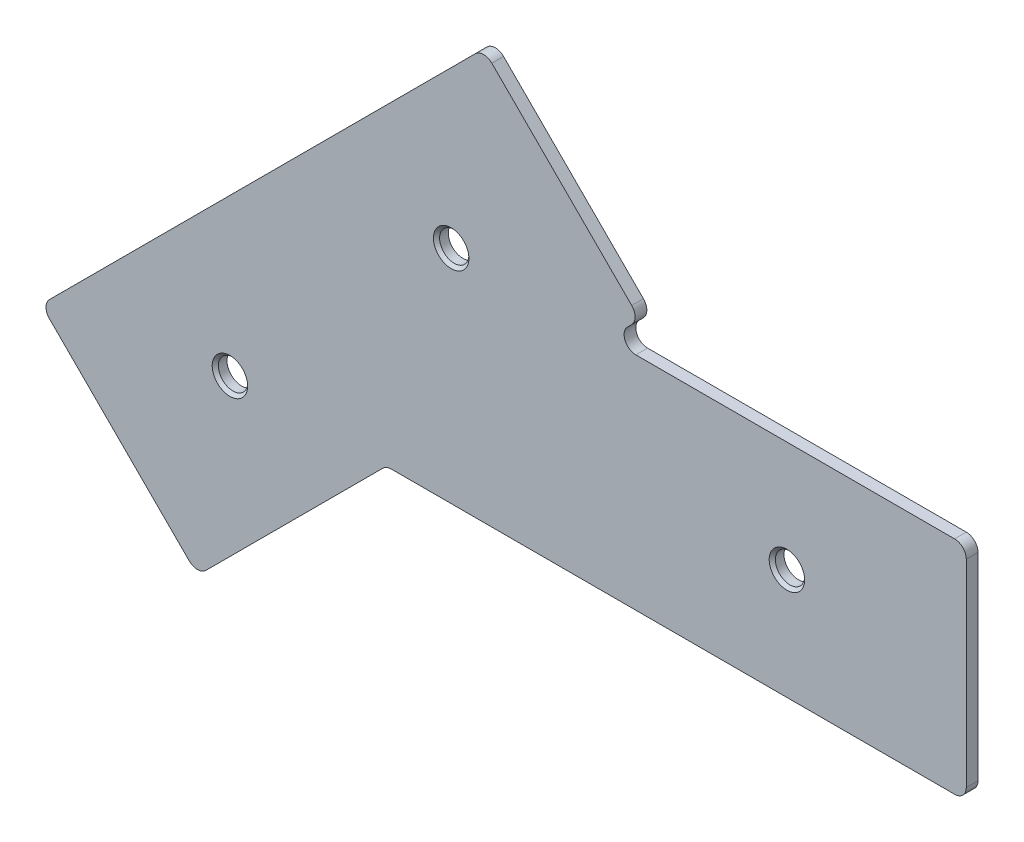
ISO-10303-21;
HEADER;
FILE_DESCRIPTION(('STEP AP214'),'2;1');
FILE_NAME('part.step','',(''),(''),'','','');
FILE_SCHEMA(('AUTOMOTIVE_DESIGN { 1 0 10303 214 1 1 1 1 }'));
ENDSEC;
DATA;
#1=APPLICATION_CONTEXT('core data for automotive mechanical design processes');
#2=APPLICATION_PROTOCOL_DEFINITION('international standard','automotive_design',2000,#1);
#3=PRODUCT_CONTEXT('',#1,'mechanical');
#4=PRODUCT('Part','Part','',(#3));
#5=PRODUCT_RELATED_PRODUCT_CATEGORY('part','',(#4));
#6=PRODUCT_DEFINITION_FORMATION('','',#4);
#7=PRODUCT_DEFINITION_CONTEXT('part definition',#1,'design');
#8=PRODUCT_DEFINITION('design','',#6,#7);
#9=PRODUCT_DEFINITION_SHAPE('','',#8);
#10=(LENGTH_UNIT() NAMED_UNIT(*) SI_UNIT(.MILLI.,.METRE.));
#11=(NAMED_UNIT(*) PLANE_ANGLE_UNIT() SI_UNIT($,.RADIAN.));
#12=(NAMED_UNIT(*) SI_UNIT($,.STERADIAN.) SOLID_ANGLE_UNIT());
#13=UNCERTAINTY_MEASURE_WITH_UNIT(LENGTH_MEASURE(1.E-05),#10,'distance_accuracy_value','');
#14=(GEOMETRIC_REPRESENTATION_CONTEXT(3) GLOBAL_UNCERTAINTY_ASSIGNED_CONTEXT((#13)) GLOBAL_UNIT_ASSIGNED_CONTEXT((#10,
#11,#12)) REPRESENTATION_CONTEXT('',''));
#15=CARTESIAN_POINT('',(0.,0.,0.));
#16=DIRECTION('',(0.,0.,1.));
#17=DIRECTION('',(1.,0.,0.));
#18=AXIS2_PLACEMENT_3D('',#15,#16,#17);
#19=CARTESIAN_POINT('',(-13.3466404948961,13.3466404948961,-2.));
#20=DIRECTION('',(-0.707106781186547,-0.707106781186547,0.));
#21=DIRECTION('',(0.707106781186548,-0.707106781186548,0.));
#22=AXIS2_PLACEMENT_3D('',#19,#20,#21);
#23=PLANE('',#22);
#24=DIRECTION('',(0.707106781186548,-0.707106781186548,0.));
#25=VECTOR('',#24,1.);
#26=CARTESIAN_POINT('',(-13.3466404948961,13.3466404948961,0.));
#27=LINE('',#26,#25);
#28=CARTESIAN_POINT('',(-11.932426932523,11.932426932523,0.));
#29=VERTEX_POINT('',#28);
#30=CARTESIAN_POINT('',(11.932426932523,-11.932426932523,0.));
#31=VERTEX_POINT('',#30);
#32=EDGE_CURVE('E284',#29,#31,#27,.T.);
#33=ORIENTED_EDGE('',*,*,#32,.F.);
#34=DIRECTION('',(0.,0.,1.));
#35=VECTOR('',#34,1.);
#36=CARTESIAN_POINT('',(-11.932426932523,11.932426932523,-2.));
#37=LINE('',#36,#35);
#38=CARTESIAN_POINT('',(-11.932426932523,11.932426932523,-2.));
#39=VERTEX_POINT('',#38);
#40=EDGE_CURVE('E226',#29,#39,#37,.F.);
#41=ORIENTED_EDGE('',*,*,#40,.T.);
#42=DIRECTION('',(0.707106781186548,-0.707106781186548,0.));
#43=VECTOR('',#42,1.);
#44=CARTESIAN_POINT('',(-13.3466404948961,13.3466404948961,-2.));
#45=LINE('',#44,#43);
#46=CARTESIAN_POINT('',(11.932426932523,-11.932426932523,-2.));
#47=VERTEX_POINT('',#46);
#48=EDGE_CURVE('E300',#39,#47,#45,.T.);
#49=ORIENTED_EDGE('',*,*,#48,.T.);
#50=DIRECTION('',(0.,0.,1.));
#51=VECTOR('',#50,1.);
#52=CARTESIAN_POINT('',(11.932426932523,-11.932426932523,-2.));
#53=LINE('',#52,#51);
#54=EDGE_CURVE('E223',#47,#31,#53,.T.);
#55=ORIENTED_EDGE('',*,*,#54,.T.);
#56=EDGE_LOOP('',(#33,#41,#49,#55));
#57=FACE_BOUND('',#56,.T.);
#58=ADVANCED_FACE('F49',(#57),#23,.T.);
#59=CARTESIAN_POINT('',(-13.3466404948961,13.3466404948961,-2.));
#60=DIRECTION('',(-0.707106781186547,0.707106781186547,0.));
#61=DIRECTION('',(-0.707106781186548,-0.707106781186548,0.));
#62=AXIS2_PLACEMENT_3D('',#59,#60,#61);
#63=PLANE('',#62);
#64=DIRECTION('',(-0.707106781186547,-0.707106781186547,0.));
#65=VECTOR('',#64,1.);
#66=CARTESIAN_POINT('',(-13.3466404948961,13.3466404948961,0.));
#67=LINE('',#66,#65);
#68=CARTESIAN_POINT('',(60.7581501734541,87.4514311632462,0.));
#69=VERTEX_POINT('',#68);
#70=CARTESIAN_POINT('',(-11.932426932523,14.7608540572692,0.));
#71=VERTEX_POINT('',#70);
#72=EDGE_CURVE('E183',#69,#71,#67,.T.);
#73=ORIENTED_EDGE('',*,*,#72,.F.);
#74=DIRECTION('',(0.,0.,1.));
#75=VECTOR('',#74,1.);
#76=CARTESIAN_POINT('',(60.7581501734541,87.4514311632462,-2.));
#77=LINE('',#76,#75);
#78=CARTESIAN_POINT('',(60.7581501734541,87.4514311632462,-2.));
#79=VERTEX_POINT('',#78);
#80=EDGE_CURVE('E210',#69,#79,#77,.F.);
#81=ORIENTED_EDGE('',*,*,#80,.T.);
#82=DIRECTION('',(-0.707106781186547,-0.707106781186547,0.));
#83=VECTOR('',#82,1.);
#84=CARTESIAN_POINT('',(-13.3466404948961,13.3466404948961,-2.));
#85=LINE('',#84,#83);
#86=CARTESIAN_POINT('',(-11.932426932523,14.7608540572692,-2.));
#87=VERTEX_POINT('',#86);
#88=EDGE_CURVE('E188',#79,#87,#85,.T.);
#89=ORIENTED_EDGE('',*,*,#88,.T.);
#90=DIRECTION('',(0.,0.,1.));
#91=VECTOR('',#90,1.);
#92=CARTESIAN_POINT('',(-11.932426932523,14.7608540572692,-2.));
#93=LINE('',#92,#91);
#94=EDGE_CURVE('E207',#87,#71,#93,.T.);
#95=ORIENTED_EDGE('',*,*,#94,.T.);
#96=EDGE_LOOP('',(#73,#81,#89,#95));
#97=FACE_BOUND('',#96,.T.);
#98=ADVANCED_FACE('F351',(#97),#63,.T.);
#99=CARTESIAN_POINT('',(62.1723637358272,88.8656447256193,-2.));
#100=DIRECTION('',(0.707106781186547,0.707106781186547,0.));
#101=DIRECTION('',(-0.707106781186548,0.707106781186548,0.));
#102=AXIS2_PLACEMENT_3D('',#99,#100,#101);
#103=PLANE('',#102);
#104=DIRECTION('',(-0.707106781186547,0.707106781186547,0.));
#105=VECTOR('',#104,1.);
#106=CARTESIAN_POINT('',(62.1723637358272,88.8656447256193,-2.));
#107=LINE('',#106,#105);
#108=CARTESIAN_POINT('',(87.4514311632462,63.5865772982002,-2.));
#109=VERTEX_POINT('',#108);
#110=CARTESIAN_POINT('',(63.5865772982003,87.4514311632462,-2.));
#111=VERTEX_POINT('',#110);
#112=EDGE_CURVE('E192',#109,#111,#107,.T.);
#113=ORIENTED_EDGE('',*,*,#112,.T.);
#114=DIRECTION('',(0.,0.,1.));
#115=VECTOR('',#114,1.);
#116=CARTESIAN_POINT('',(63.5865772982003,87.4514311632462,-2.));
#117=LINE('',#116,#115);
#118=CARTESIAN_POINT('',(63.5865772982003,87.4514311632462,0.));
#119=VERTEX_POINT('',#118);
#120=EDGE_CURVE('E174',#111,#119,#117,.T.);
#121=ORIENTED_EDGE('',*,*,#120,.T.);
#122=DIRECTION('',(-0.707106781186547,0.707106781186547,0.));
#123=VECTOR('',#122,1.);
#124=CARTESIAN_POINT('',(62.1723637358272,88.8656447256193,0.));
#125=LINE('',#124,#123);
#126=CARTESIAN_POINT('',(87.4514311632462,63.5865772982002,0.));
#127=VERTEX_POINT('',#126);
#128=EDGE_CURVE('E166',#127,#119,#125,.T.);
#129=ORIENTED_EDGE('',*,*,#128,.F.);
#130=DIRECTION('',(0.,0.,1.));
#131=VECTOR('',#130,1.);
#132=CARTESIAN_POINT('',(87.4514311632462,63.5865772982002,-2.));
#133=LINE('',#132,#131);
#134=EDGE_CURVE('E180',#127,#109,#133,.F.);
#135=ORIENTED_EDGE('',*,*,#134,.T.);
#136=EDGE_LOOP('',(#113,#121,#129,#135));
#137=FACE_BOUND('',#136,.T.);
#138=ADVANCED_FACE('F179',(#137),#103,.T.);
#139=CARTESIAN_POINT('',(83.3277831051539,56.6345021153617,-2.));
#140=DIRECTION('',(0.707106781186547,-0.707106781186548,0.));
#141=DIRECTION('',(0.707106781186548,0.707106781186547,0.));
#142=AXIS2_PLACEMENT_3D('',#139,#140,#141);
#143=PLANE('',#142);
#144=DIRECTION('',(0.707106781186548,0.707106781186547,0.));
#145=VECTOR('',#144,1.);
#146=CARTESIAN_POINT('',(83.3277831051539,56.6345021153617,-2.));
#147=LINE('',#146,#145);
#148=CARTESIAN_POINT('',(86.741996667527,60.0487156777348,-2.));
#149=VERTEX_POINT('',#148);
#150=CARTESIAN_POINT('',(87.4514311632462,60.7581501734541,-2.));
#151=VERTEX_POINT('',#150);
#152=EDGE_CURVE('E271',#149,#151,#147,.T.);
#153=ORIENTED_EDGE('',*,*,#152,.T.);
#154=DIRECTION('',(0.,0.,1.));
#155=VECTOR('',#154,1.);
#156=CARTESIAN_POINT('',(87.4514311632462,60.7581501734541,-2.));
#157=LINE('',#156,#155);
#158=CARTESIAN_POINT('',(87.4514311632462,60.7581501734541,0.));
#159=VERTEX_POINT('',#158);
#160=EDGE_CURVE('E249',#151,#159,#157,.T.);
#161=ORIENTED_EDGE('',*,*,#160,.T.);
#162=DIRECTION('',(0.707106781186548,0.707106781186547,0.));
#163=VECTOR('',#162,1.);
#164=CARTESIAN_POINT('',(83.3277831051539,56.6345021153617,0.));
#165=LINE('',#164,#163);
#166=CARTESIAN_POINT('',(86.741996667527,60.0487156777348,0.));
#167=VERTEX_POINT('',#166);
#168=EDGE_CURVE('E168',#167,#159,#165,.T.);
#169=ORIENTED_EDGE('',*,*,#168,.F.);
#170=DIRECTION('',(0.,0.,1.));
#171=VECTOR('',#170,1.);
#172=CARTESIAN_POINT('',(86.741996667527,60.0487156777348,-2.));
#173=LINE('',#172,#171);
#174=EDGE_CURVE('E247',#167,#149,#173,.F.);
#175=ORIENTED_EDGE('',*,*,#174,.T.);
#176=EDGE_LOOP('',(#153,#161,#169,#175));
#177=FACE_BOUND('',#176,.T.);
#178=ADVANCED_FACE('F261',(#177),#143,.T.);
#179=CARTESIAN_POINT('',(83.3277831051539,56.6345021153617,-2.));
#180=DIRECTION('',(0.,1.,0.));
#181=DIRECTION('',(0.,0.,1.));
#182=AXIS2_PLACEMENT_3D('',#179,#180,#181);
#183=PLANE('',#182);
#184=DIRECTION('',(-1.,0.,0.));
#185=VECTOR('',#184,1.);
#186=CARTESIAN_POINT('',(83.3277831051539,56.6345021153617,0.));
#187=LINE('',#186,#185);
#188=CARTESIAN_POINT('',(142.559502115362,56.6345021153617,0.));
#189=VERTEX_POINT('',#188);
#190=CARTESIAN_POINT('',(88.1562102299001,56.6345021153617,0.));
#191=VERTEX_POINT('',#190);
#192=EDGE_CURVE('E255',#189,#191,#187,.T.);
#193=ORIENTED_EDGE('',*,*,#192,.F.);
#194=DIRECTION('',(0.,0.,1.));
#195=VECTOR('',#194,1.);
#196=CARTESIAN_POINT('',(142.559502115362,56.6345021153617,-2.));
#197=LINE('',#196,#195);
#198=CARTESIAN_POINT('',(142.559502115362,56.6345021153617,-2.));
#199=VERTEX_POINT('',#198);
#200=EDGE_CURVE('E245',#189,#199,#197,.F.);
#201=ORIENTED_EDGE('',*,*,#200,.T.);
#202=DIRECTION('',(-1.,0.,0.));
#203=VECTOR('',#202,1.);
#204=CARTESIAN_POINT('',(83.3277831051539,56.6345021153617,-2.));
#205=LINE('',#204,#203);
#206=CARTESIAN_POINT('',(88.1562102299001,56.6345021153617,-2.));
#207=VERTEX_POINT('',#206);
#208=EDGE_CURVE('E269',#199,#207,#205,.T.);
#209=ORIENTED_EDGE('',*,*,#208,.T.);
#210=DIRECTION('',(0.,0.,1.));
#211=VECTOR('',#210,1.);
#212=CARTESIAN_POINT('',(88.1562102299001,56.6345021153617,0.));
#213=LINE('',#212,#211);
#214=EDGE_CURVE('E242',#207,#191,#213,.T.);
#215=ORIENTED_EDGE('',*,*,#214,.T.);
#216=EDGE_LOOP('',(#193,#201,#209,#215));
#217=FACE_BOUND('',#216,.T.);
#218=ADVANCED_FACE('F273',(#217),#183,.T.);
#219=CARTESIAN_POINT('',(144.559502115362,56.6345021153617,-2.));
#220=DIRECTION('',(1.,0.,0.));
#221=DIRECTION('',(0.,0.,-1.));
#222=AXIS2_PLACEMENT_3D('',#219,#220,#221);
#223=PLANE('',#222);
#224=DIRECTION('',(0.,1.,0.));
#225=VECTOR('',#224,1.);
#226=CARTESIAN_POINT('',(144.559502115362,56.6345021153617,0.));
#227=LINE('',#226,#225);
#228=CARTESIAN_POINT('',(144.559502115362,20.8845021153617,0.));
#229=VERTEX_POINT('',#228);
#230=CARTESIAN_POINT('',(144.559502115362,54.6345021153617,0.));
#231=VERTEX_POINT('',#230);
#232=EDGE_CURVE('E294',#229,#231,#227,.T.);
#233=ORIENTED_EDGE('',*,*,#232,.F.);
#234=DIRECTION('',(0.,0.,1.));
#235=VECTOR('',#234,1.);
#236=CARTESIAN_POINT('',(144.559502115362,20.8845021153617,-2.));
#237=LINE('',#236,#235);
#238=CARTESIAN_POINT('',(144.559502115362,20.8845021153617,-2.));
#239=VERTEX_POINT('',#238);
#240=EDGE_CURVE('E240',#229,#239,#237,.F.);
#241=ORIENTED_EDGE('',*,*,#240,.T.);
#242=DIRECTION('',(0.,1.,0.));
#243=VECTOR('',#242,1.);
#244=CARTESIAN_POINT('',(144.559502115362,56.6345021153617,-2.));
#245=LINE('',#244,#243);
#246=CARTESIAN_POINT('',(144.559502115362,54.6345021153617,-2.));
#247=VERTEX_POINT('',#246);
#248=EDGE_CURVE('E275',#239,#247,#245,.T.);
#249=ORIENTED_EDGE('',*,*,#248,.T.);
#250=DIRECTION('',(0.,0.,1.));
#251=VECTOR('',#250,1.);
#252=CARTESIAN_POINT('',(144.559502115362,54.6345021153617,-2.));
#253=LINE('',#252,#251);
#254=EDGE_CURVE('E237',#247,#231,#253,.T.);
#255=ORIENTED_EDGE('',*,*,#254,.T.);
#256=EDGE_LOOP('',(#233,#241,#249,#255));
#257=FACE_BOUND('',#256,.T.);
#258=ADVANCED_FACE('F337',(#257),#223,.T.);
#259=CARTESIAN_POINT('',(45.5777831051539,18.8845021153617,-2.));
#260=DIRECTION('',(0.,-1.,0.));
#261=DIRECTION('',(1.,0.,0.));
#262=AXIS2_PLACEMENT_3D('',#259,#260,#261);
#263=PLANE('',#262);
#264=DIRECTION('',(1.,0.,0.));
#265=VECTOR('',#264,1.);
#266=CARTESIAN_POINT('',(45.5777831051539,18.8845021153617,0.));
#267=LINE('',#266,#265);
#268=CARTESIAN_POINT('',(46.4062102299001,18.8845021153617,0.));
#269=VERTEX_POINT('',#268);
#270=CARTESIAN_POINT('',(142.559502115362,18.8845021153617,0.));
#271=VERTEX_POINT('',#270);
#272=EDGE_CURVE('E291',#269,#271,#267,.T.);
#273=ORIENTED_EDGE('',*,*,#272,.F.);
#274=DIRECTION('',(0.,0.,1.));
#275=VECTOR('',#274,1.);
#276=CARTESIAN_POINT('',(46.4062102299001,18.8845021153617,-2.));
#277=LINE('',#276,#275);
#278=CARTESIAN_POINT('',(46.4062102299001,18.8845021153617,-2.));
#279=VERTEX_POINT('',#278);
#280=EDGE_CURVE('E235',#269,#279,#277,.F.);
#281=ORIENTED_EDGE('',*,*,#280,.T.);
#282=DIRECTION('',(1.,0.,0.));
#283=VECTOR('',#282,1.);
#284=CARTESIAN_POINT('',(45.5777831051539,18.8845021153617,-2.));
#285=LINE('',#284,#283);
#286=CARTESIAN_POINT('',(142.559502115362,18.8845021153617,-2.));
#287=VERTEX_POINT('',#286);
#288=EDGE_CURVE('E279',#279,#287,#285,.T.);
#289=ORIENTED_EDGE('',*,*,#288,.T.);
#290=DIRECTION('',(0.,0.,1.));
#291=VECTOR('',#290,1.);
#292=CARTESIAN_POINT('',(142.559502115362,18.8845021153617,-2.));
#293=LINE('',#292,#291);
#294=EDGE_CURVE('E232',#287,#271,#293,.T.);
#295=ORIENTED_EDGE('',*,*,#294,.T.);
#296=EDGE_LOOP('',(#273,#281,#289,#295));
#297=FACE_BOUND('',#296,.T.);
#298=ADVANCED_FACE('F329',(#297),#263,.T.);
#299=CARTESIAN_POINT('',(13.3466404948961,-13.3466404948961,-2.));
#300=DIRECTION('',(0.707106781186547,-0.707106781186547,0.));
#301=DIRECTION('',(0.707106781186548,0.707106781186548,0.));
#302=AXIS2_PLACEMENT_3D('',#299,#300,#301);
#303=PLANE('',#302);
#304=DIRECTION('',(0.707106781186548,0.707106781186548,0.));
#305=VECTOR('',#304,1.);
#306=CARTESIAN_POINT('',(13.3466404948961,-13.3466404948961,0.));
#307=LINE('',#306,#305);
#308=CARTESIAN_POINT('',(14.7608540572692,-11.932426932523,0.));
#309=VERTEX_POINT('',#308);
#310=CARTESIAN_POINT('',(44.991996667527,18.2987156777348,0.));
#311=VERTEX_POINT('',#310);
#312=EDGE_CURVE('E287',#309,#311,#307,.T.);
#313=ORIENTED_EDGE('',*,*,#312,.F.);
#314=DIRECTION('',(0.,0.,1.));
#315=VECTOR('',#314,1.);
#316=CARTESIAN_POINT('',(14.7608540572692,-11.932426932523,-2.));
#317=LINE('',#316,#315);
#318=CARTESIAN_POINT('',(14.7608540572692,-11.932426932523,-2.));
#319=VERTEX_POINT('',#318);
#320=EDGE_CURVE('E71',#309,#319,#317,.F.);
#321=ORIENTED_EDGE('',*,*,#320,.T.);
#322=DIRECTION('',(0.707106781186548,0.707106781186548,0.));
#323=VECTOR('',#322,1.);
#324=CARTESIAN_POINT('',(13.3466404948961,-13.3466404948961,-2.));
#325=LINE('',#324,#323);
#326=CARTESIAN_POINT('',(44.991996667527,18.2987156777348,-2.));
#327=VERTEX_POINT('',#326);
#328=EDGE_CURVE('E324',#319,#327,#325,.T.);
#329=ORIENTED_EDGE('',*,*,#328,.T.);
#330=DIRECTION('',(0.,0.,1.));
#331=VECTOR('',#330,1.);
#332=CARTESIAN_POINT('',(44.991996667527,18.2987156777348,0.));
#333=LINE('',#332,#331);
#334=EDGE_CURVE('E228',#327,#311,#333,.T.);
#335=ORIENTED_EDGE('',*,*,#334,.T.);
#336=EDGE_LOOP('',(#313,#321,#329,#335));
#337=FACE_BOUND('',#336,.T.);
#338=ADVANCED_FACE('F363',(#337),#303,.T.);
#339=CARTESIAN_POINT('',(0.,0.,-2.));
#340=DIRECTION('',(0.,0.,1.));
#341=DIRECTION('',(1.,0.,0.));
#342=AXIS2_PLACEMENT_3D('',#339,#340,#341);
#343=PLANE('',#342);
#344=CARTESIAN_POINT('',(56.6392531730424,56.6392531730424,-2.));
#345=DIRECTION('',(0.,0.,1.));
#346=DIRECTION('',(1.,0.,0.));
#347=AXIS2_PLACEMENT_3D('',#344,#345,#346);
#348=CIRCLE('',#347,2.49999999999999);
#349=CARTESIAN_POINT('',(59.1392531730424,56.6392531730424,-2.));
#350=VERTEX_POINT('',#349);
#351=EDGE_CURVE('E195',#350,#350,#348,.T.);
#352=ORIENTED_EDGE('',*,*,#351,.T.);
#353=EDGE_LOOP('',(#352));
#354=FACE_BOUND('',#353,.T.);
#355=CARTESIAN_POINT('',(18.8797510576808,18.8797510576808,-2.));
#356=DIRECTION('',(0.,0.,1.));
#357=DIRECTION('',(1.,0.,0.));
#358=AXIS2_PLACEMENT_3D('',#355,#356,#357);
#359=CIRCLE('',#358,2.49999999999999);
#360=CARTESIAN_POINT('',(21.3797510576808,18.8797510576808,-2.));
#361=VERTEX_POINT('',#360);
#362=EDGE_CURVE('E303',#361,#361,#359,.T.);
#363=ORIENTED_EDGE('',*,*,#362,.T.);
#364=EDGE_LOOP('',(#363));
#365=FACE_BOUND('',#364,.T.);
#366=CARTESIAN_POINT('',(113.943642610258,37.7595021153617,-2.));
#367=DIRECTION('',(0.,0.,1.));
#368=DIRECTION('',(1.,0.,0.));
#369=AXIS2_PLACEMENT_3D('',#366,#367,#368);
#370=CIRCLE('',#369,2.49999999999999);
#371=CARTESIAN_POINT('',(116.443642610258,37.7595021153617,-2.));
#372=VERTEX_POINT('',#371);
#373=EDGE_CURVE('E288',#372,#372,#370,.T.);
#374=ORIENTED_EDGE('',*,*,#373,.T.);
#375=EDGE_LOOP('',(#374));
#376=FACE_BOUND('',#375,.T.);
#377=ORIENTED_EDGE('',*,*,#88,.F.);
#378=CARTESIAN_POINT('',(62.1723637358272,86.0372176008731,-2.));
#379=DIRECTION('',(0.,0.,1.));
#380=DIRECTION('',(1.,0.,0.));
#381=AXIS2_PLACEMENT_3D('',#378,#379,#380);
#382=CIRCLE('',#381,2.);
#383=EDGE_CURVE('E221',#79,#111,#382,.F.);
#384=ORIENTED_EDGE('',*,*,#383,.T.);
#385=ORIENTED_EDGE('',*,*,#112,.F.);
#386=CARTESIAN_POINT('',(86.0372176008732,62.1723637358272,-2.));
#387=DIRECTION('',(0.,0.,1.));
#388=DIRECTION('',(1.,0.,0.));
#389=AXIS2_PLACEMENT_3D('',#386,#387,#388);
#390=CIRCLE('',#389,2.);
#391=EDGE_CURVE('E187',#109,#151,#390,.F.);
#392=ORIENTED_EDGE('',*,*,#391,.T.);
#393=ORIENTED_EDGE('',*,*,#152,.F.);
#394=CARTESIAN_POINT('',(88.1562102299001,58.6345021153617,-2.));
#395=DIRECTION('',(0.,0.,1.));
#396=DIRECTION('',(1.,0.,0.));
#397=AXIS2_PLACEMENT_3D('',#394,#395,#396);
#398=CIRCLE('',#397,2.);
#399=EDGE_CURVE('E11',#149,#207,#398,.T.);
#400=ORIENTED_EDGE('',*,*,#399,.T.);
#401=ORIENTED_EDGE('',*,*,#208,.F.);
#402=CARTESIAN_POINT('',(142.559502115362,54.6345021153617,-2.));
#403=DIRECTION('',(0.,0.,1.));
#404=DIRECTION('',(1.,0.,0.));
#405=AXIS2_PLACEMENT_3D('',#402,#403,#404);
#406=CIRCLE('',#405,2.);
#407=EDGE_CURVE('E213',#199,#247,#406,.F.);
#408=ORIENTED_EDGE('',*,*,#407,.T.);
#409=ORIENTED_EDGE('',*,*,#248,.F.);
#410=CARTESIAN_POINT('',(142.559502115362,20.8845021153617,-2.));
#411=DIRECTION('',(0.,0.,1.));
#412=DIRECTION('',(1.,0.,0.));
#413=AXIS2_PLACEMENT_3D('',#410,#411,#412);
#414=CIRCLE('',#413,2.);
#415=EDGE_CURVE('E215',#239,#287,#414,.F.);
#416=ORIENTED_EDGE('',*,*,#415,.T.);
#417=ORIENTED_EDGE('',*,*,#288,.F.);
#418=CARTESIAN_POINT('',(46.4062102299001,16.8845021153617,-2.));
#419=DIRECTION('',(0.,0.,1.));
#420=DIRECTION('',(1.,0.,0.));
#421=AXIS2_PLACEMENT_3D('',#418,#419,#420);
#422=CIRCLE('',#421,2.);
#423=EDGE_CURVE('E64',#279,#327,#422,.T.);
#424=ORIENTED_EDGE('',*,*,#423,.T.);
#425=ORIENTED_EDGE('',*,*,#328,.F.);
#426=CARTESIAN_POINT('',(13.3466404948961,-10.5182133701499,-2.));
#427=DIRECTION('',(0.,0.,1.));
#428=DIRECTION('',(1.,0.,0.));
#429=AXIS2_PLACEMENT_3D('',#426,#427,#428);
#430=CIRCLE('',#429,2.);
#431=EDGE_CURVE('E217',#319,#47,#430,.F.);
#432=ORIENTED_EDGE('',*,*,#431,.T.);
#433=ORIENTED_EDGE('',*,*,#48,.F.);
#434=CARTESIAN_POINT('',(-10.5182133701499,13.3466404948961,-2.));
#435=DIRECTION('',(0.,0.,1.));
#436=DIRECTION('',(1.,0.,0.));
#437=AXIS2_PLACEMENT_3D('',#434,#435,#436);
#438=CIRCLE('',#437,2.);
#439=EDGE_CURVE('E219',#39,#87,#438,.F.);
#440=ORIENTED_EDGE('',*,*,#439,.T.);
#441=EDGE_LOOP('',(#377,#384,#385,#392,#393,#400,#401,#408,#409,#416,#417,#424,#425,#432,#433,#440));
#442=FACE_BOUND('',#441,.T.);
#443=ADVANCED_FACE('F268',(#354,#365,#376,#442),#343,.F.);
#444=CARTESIAN_POINT('',(0.,0.,0.));
#445=DIRECTION('',(0.,0.,1.));
#446=DIRECTION('',(1.,0.,0.));
#447=AXIS2_PLACEMENT_3D('',#444,#445,#446);
#448=PLANE('',#447);
#449=CARTESIAN_POINT('',(56.6392531730424,56.6392531730424,0.));
#450=DIRECTION('',(0.,0.,1.));
#451=DIRECTION('',(1.,0.,0.));
#452=AXIS2_PLACEMENT_3D('',#449,#450,#451);
#453=CIRCLE('',#452,3.025);
#454=CARTESIAN_POINT('',(59.6642531730424,56.6392531730424,0.));
#455=VERTEX_POINT('',#454);
#456=EDGE_CURVE('E443',#455,#455,#453,.T.);
#457=ORIENTED_EDGE('',*,*,#456,.F.);
#458=EDGE_LOOP('',(#457));
#459=FACE_BOUND('',#458,.T.);
#460=CARTESIAN_POINT('',(18.8797510576808,18.8797510576808,0.));
#461=DIRECTION('',(0.,0.,1.));
#462=DIRECTION('',(1.,0.,0.));
#463=AXIS2_PLACEMENT_3D('',#460,#461,#462);
#464=CIRCLE('',#463,3.025);
#465=CARTESIAN_POINT('',(21.9047510576808,18.8797510576808,0.));
#466=VERTEX_POINT('',#465);
#467=EDGE_CURVE('E312',#466,#466,#464,.T.);
#468=ORIENTED_EDGE('',*,*,#467,.F.);
#469=EDGE_LOOP('',(#468));
#470=FACE_BOUND('',#469,.T.);
#471=CARTESIAN_POINT('',(113.943642610258,37.7595021153617,0.));
#472=DIRECTION('',(0.,0.,1.));
#473=DIRECTION('',(1.,0.,0.));
#474=AXIS2_PLACEMENT_3D('',#471,#472,#473);
#475=CIRCLE('',#474,3.025);
#476=CARTESIAN_POINT('',(116.968642610258,37.7595021153617,0.));
#477=VERTEX_POINT('',#476);
#478=EDGE_CURVE('E305',#477,#477,#475,.T.);
#479=ORIENTED_EDGE('',*,*,#478,.F.);
#480=EDGE_LOOP('',(#479));
#481=FACE_BOUND('',#480,.T.);
#482=ORIENTED_EDGE('',*,*,#128,.T.);
#483=CARTESIAN_POINT('',(62.1723637358272,86.0372176008731,0.));
#484=DIRECTION('',(0.,0.,1.));
#485=DIRECTION('',(1.,0.,0.));
#486=AXIS2_PLACEMENT_3D('',#483,#484,#485);
#487=CIRCLE('',#486,2.);
#488=EDGE_CURVE('E205',#119,#69,#487,.T.);
#489=ORIENTED_EDGE('',*,*,#488,.T.);
#490=ORIENTED_EDGE('',*,*,#72,.T.);
#491=CARTESIAN_POINT('',(-10.5182133701499,13.3466404948961,0.));
#492=DIRECTION('',(0.,0.,1.));
#493=DIRECTION('',(1.,0.,0.));
#494=AXIS2_PLACEMENT_3D('',#491,#492,#493);
#495=CIRCLE('',#494,2.);
#496=EDGE_CURVE('E203',#71,#29,#495,.T.);
#497=ORIENTED_EDGE('',*,*,#496,.T.);
#498=ORIENTED_EDGE('',*,*,#32,.T.);
#499=CARTESIAN_POINT('',(13.3466404948961,-10.5182133701499,0.));
#500=DIRECTION('',(0.,0.,1.));
#501=DIRECTION('',(1.,0.,0.));
#502=AXIS2_PLACEMENT_3D('',#499,#500,#501);
#503=CIRCLE('',#502,2.);
#504=EDGE_CURVE('E201',#31,#309,#503,.T.);
#505=ORIENTED_EDGE('',*,*,#504,.T.);
#506=ORIENTED_EDGE('',*,*,#312,.T.);
#507=CARTESIAN_POINT('',(46.4062102299001,16.8845021153617,0.));
#508=DIRECTION('',(0.,0.,1.));
#509=DIRECTION('',(1.,0.,0.));
#510=AXIS2_PLACEMENT_3D('',#507,#508,#509);
#511=CIRCLE('',#510,2.);
#512=EDGE_CURVE('E251',#311,#269,#511,.F.);
#513=ORIENTED_EDGE('',*,*,#512,.T.);
#514=ORIENTED_EDGE('',*,*,#272,.T.);
#515=CARTESIAN_POINT('',(142.559502115362,20.8845021153617,0.));
#516=DIRECTION('',(0.,0.,1.));
#517=DIRECTION('',(1.,0.,0.));
#518=AXIS2_PLACEMENT_3D('',#515,#516,#517);
#519=CIRCLE('',#518,2.);
#520=EDGE_CURVE('E199',#271,#229,#519,.T.);
#521=ORIENTED_EDGE('',*,*,#520,.T.);
#522=ORIENTED_EDGE('',*,*,#232,.T.);
#523=CARTESIAN_POINT('',(142.559502115362,54.6345021153617,0.));
#524=DIRECTION('',(0.,0.,1.));
#525=DIRECTION('',(1.,0.,0.));
#526=AXIS2_PLACEMENT_3D('',#523,#524,#525);
#527=CIRCLE('',#526,2.);
#528=EDGE_CURVE('E173',#231,#189,#527,.T.);
#529=ORIENTED_EDGE('',*,*,#528,.T.);
#530=ORIENTED_EDGE('',*,*,#192,.T.);
#531=CARTESIAN_POINT('',(88.1562102299001,58.6345021153617,0.));
#532=DIRECTION('',(0.,0.,1.));
#533=DIRECTION('',(1.,0.,0.));
#534=AXIS2_PLACEMENT_3D('',#531,#532,#533);
#535=CIRCLE('',#534,2.);
#536=EDGE_CURVE('E57',#191,#167,#535,.F.);
#537=ORIENTED_EDGE('',*,*,#536,.T.);
#538=ORIENTED_EDGE('',*,*,#168,.T.);
#539=CARTESIAN_POINT('',(86.0372176008732,62.1723637358272,0.));
#540=DIRECTION('',(0.,0.,1.));
#541=DIRECTION('',(1.,0.,0.));
#542=AXIS2_PLACEMENT_3D('',#539,#540,#541);
#543=CIRCLE('',#542,2.);
#544=EDGE_CURVE('E163',#159,#127,#543,.T.);
#545=ORIENTED_EDGE('',*,*,#544,.T.);
#546=EDGE_LOOP('',(#482,#489,#490,#497,#498,#505,#506,#513,#514,#521,#522,#529,#530,#537,#538,#545));
#547=FACE_BOUND('',#546,.T.);
#548=ADVANCED_FACE('F165',(#459,#470,#481,#547),#448,.T.);
#549=CARTESIAN_POINT('',(113.943642610258,37.7595021153617,0.));
#550=DIRECTION('',(0.,0.,1.));
#551=DIRECTION('',(1.,0.,0.));
#552=AXIS2_PLACEMENT_3D('',#549,#550,#551);
#553=CYLINDRICAL_SURFACE('',#552,2.49999999999999);
#554=CARTESIAN_POINT('',(113.943642610258,37.7595021153617,-0.525000000000012));
#555=DIRECTION('',(0.,0.,1.));
#556=DIRECTION('',(1.,0.,0.));
#557=AXIS2_PLACEMENT_3D('',#554,#555,#556);
#558=CIRCLE('',#557,2.49999999999999);
#559=CARTESIAN_POINT('',(116.443642610258,37.7595021153617,-0.525000000000012));
#560=VERTEX_POINT('',#559);
#561=EDGE_CURVE('E302',#560,#560,#558,.T.);
#562=ORIENTED_EDGE('',*,*,#561,.T.);
#563=EDGE_LOOP('',(#562));
#564=FACE_BOUND('',#563,.T.);
#565=ORIENTED_EDGE('',*,*,#373,.F.);
#566=EDGE_LOOP('',(#565));
#567=FACE_BOUND('',#566,.T.);
#568=ADVANCED_FACE('F411',(#564,#567),#553,.F.);
#569=CARTESIAN_POINT('',(113.943642610258,37.7595021153617,0.));
#570=DIRECTION('',(0.,0.,1.));
#571=DIRECTION('',(1.,0.,0.));
#572=AXIS2_PLACEMENT_3D('',#569,#570,#571);
#573=CONICAL_SURFACE('',#572,3.025,0.785398163397447);
#574=ORIENTED_EDGE('',*,*,#561,.F.);
#575=EDGE_LOOP('',(#574));
#576=FACE_BOUND('',#575,.T.);
#577=ORIENTED_EDGE('',*,*,#478,.T.);
#578=EDGE_LOOP('',(#577));
#579=FACE_BOUND('',#578,.T.);
#580=ADVANCED_FACE('F416',(#576,#579),#573,.F.);
#581=CARTESIAN_POINT('',(18.8797510576808,18.8797510576808,0.));
#582=DIRECTION('',(0.,0.,1.));
#583=DIRECTION('',(1.,0.,0.));
#584=AXIS2_PLACEMENT_3D('',#581,#582,#583);
#585=CYLINDRICAL_SURFACE('',#584,2.49999999999999);
#586=CARTESIAN_POINT('',(18.8797510576808,18.8797510576808,-0.525000000000012));
#587=DIRECTION('',(0.,0.,1.));
#588=DIRECTION('',(1.,0.,0.));
#589=AXIS2_PLACEMENT_3D('',#586,#587,#588);
#590=CIRCLE('',#589,2.49999999999999);
#591=CARTESIAN_POINT('',(21.3797510576808,18.8797510576808,-0.525000000000012));
#592=VERTEX_POINT('',#591);
#593=EDGE_CURVE('E306',#592,#592,#590,.T.);
#594=ORIENTED_EDGE('',*,*,#593,.T.);
#595=EDGE_LOOP('',(#594));
#596=FACE_BOUND('',#595,.T.);
#597=ORIENTED_EDGE('',*,*,#362,.F.);
#598=EDGE_LOOP('',(#597));
#599=FACE_BOUND('',#598,.T.);
#600=ADVANCED_FACE('F420',(#596,#599),#585,.F.);
#601=CARTESIAN_POINT('',(18.8797510576808,18.8797510576808,0.));
#602=DIRECTION('',(0.,0.,1.));
#603=DIRECTION('',(1.,0.,0.));
#604=AXIS2_PLACEMENT_3D('',#601,#602,#603);
#605=CONICAL_SURFACE('',#604,3.025,0.785398163397447);
#606=ORIENTED_EDGE('',*,*,#593,.F.);
#607=EDGE_LOOP('',(#606));
#608=FACE_BOUND('',#607,.T.);
#609=ORIENTED_EDGE('',*,*,#467,.T.);
#610=EDGE_LOOP('',(#609));
#611=FACE_BOUND('',#610,.T.);
#612=ADVANCED_FACE('F424',(#608,#611),#605,.F.);
#613=CARTESIAN_POINT('',(56.6392531730424,56.6392531730424,0.));
#614=DIRECTION('',(0.,0.,1.));
#615=DIRECTION('',(1.,0.,0.));
#616=AXIS2_PLACEMENT_3D('',#613,#614,#615);
#617=CYLINDRICAL_SURFACE('',#616,2.49999999999999);
#618=CARTESIAN_POINT('',(56.6392531730424,56.6392531730424,-0.525000000000012));
#619=DIRECTION('',(0.,0.,1.));
#620=DIRECTION('',(1.,0.,0.));
#621=AXIS2_PLACEMENT_3D('',#618,#619,#620);
#622=CIRCLE('',#621,2.49999999999999);
#623=CARTESIAN_POINT('',(59.1392531730424,56.6392531730424,-0.525000000000012));
#624=VERTEX_POINT('',#623);
#625=EDGE_CURVE('E440',#624,#624,#622,.T.);
#626=ORIENTED_EDGE('',*,*,#625,.T.);
#627=EDGE_LOOP('',(#626));
#628=FACE_BOUND('',#627,.T.);
#629=ORIENTED_EDGE('',*,*,#351,.F.);
#630=EDGE_LOOP('',(#629));
#631=FACE_BOUND('',#630,.T.);
#632=ADVANCED_FACE('F427',(#628,#631),#617,.F.);
#633=CARTESIAN_POINT('',(56.6392531730424,56.6392531730424,0.));
#634=DIRECTION('',(0.,0.,1.));
#635=DIRECTION('',(1.,0.,0.));
#636=AXIS2_PLACEMENT_3D('',#633,#634,#635);
#637=CONICAL_SURFACE('',#636,3.025,0.785398163397447);
#638=ORIENTED_EDGE('',*,*,#625,.F.);
#639=EDGE_LOOP('',(#638));
#640=FACE_BOUND('',#639,.T.);
#641=ORIENTED_EDGE('',*,*,#456,.T.);
#642=EDGE_LOOP('',(#641));
#643=FACE_BOUND('',#642,.T.);
#644=ADVANCED_FACE('F369',(#640,#643),#637,.F.);
#645=CARTESIAN_POINT('',(62.1723637358272,86.0372176008731,-2.));
#646=DIRECTION('',(0.,0.,1.));
#647=DIRECTION('',(1.,0.,0.));
#648=AXIS2_PLACEMENT_3D('',#645,#646,#647);
#649=CYLINDRICAL_SURFACE('',#648,2.);
#650=ORIENTED_EDGE('',*,*,#383,.F.);
#651=ORIENTED_EDGE('',*,*,#80,.F.);
#652=ORIENTED_EDGE('',*,*,#488,.F.);
#653=ORIENTED_EDGE('',*,*,#120,.F.);
#654=EDGE_LOOP('',(#650,#651,#652,#653));
#655=FACE_BOUND('',#654,.T.);
#656=ADVANCED_FACE('F365',(#655),#649,.T.);
#657=CARTESIAN_POINT('',(-10.5182133701499,13.3466404948961,-2.));
#658=DIRECTION('',(0.,0.,1.));
#659=DIRECTION('',(1.,0.,0.));
#660=AXIS2_PLACEMENT_3D('',#657,#658,#659);
#661=CYLINDRICAL_SURFACE('',#660,2.);
#662=ORIENTED_EDGE('',*,*,#439,.F.);
#663=ORIENTED_EDGE('',*,*,#40,.F.);
#664=ORIENTED_EDGE('',*,*,#496,.F.);
#665=ORIENTED_EDGE('',*,*,#94,.F.);
#666=EDGE_LOOP('',(#662,#663,#664,#665));
#667=FACE_BOUND('',#666,.T.);
#668=ADVANCED_FACE('F368',(#667),#661,.T.);
#669=CARTESIAN_POINT('',(13.3466404948961,-10.5182133701499,-2.));
#670=DIRECTION('',(0.,0.,1.));
#671=DIRECTION('',(1.,0.,0.));
#672=AXIS2_PLACEMENT_3D('',#669,#670,#671);
#673=CYLINDRICAL_SURFACE('',#672,2.);
#674=ORIENTED_EDGE('',*,*,#431,.F.);
#675=ORIENTED_EDGE('',*,*,#320,.F.);
#676=ORIENTED_EDGE('',*,*,#504,.F.);
#677=ORIENTED_EDGE('',*,*,#54,.F.);
#678=EDGE_LOOP('',(#674,#675,#676,#677));
#679=FACE_BOUND('',#678,.T.);
#680=ADVANCED_FACE('F373',(#679),#673,.T.);
#681=CARTESIAN_POINT('',(46.4062102299001,16.8845021153617,-2.));
#682=DIRECTION('',(0.,0.,-1.));
#683=DIRECTION('',(-1.,0.,0.));
#684=AXIS2_PLACEMENT_3D('',#681,#682,#683);
#685=CYLINDRICAL_SURFACE('',#684,2.);
#686=ORIENTED_EDGE('',*,*,#423,.F.);
#687=ORIENTED_EDGE('',*,*,#280,.F.);
#688=ORIENTED_EDGE('',*,*,#512,.F.);
#689=ORIENTED_EDGE('',*,*,#334,.F.);
#690=EDGE_LOOP('',(#686,#687,#688,#689));
#691=FACE_BOUND('',#690,.T.);
#692=ADVANCED_FACE('F348',(#691),#685,.F.);
#693=CARTESIAN_POINT('',(142.559502115362,20.8845021153617,-2.));
#694=DIRECTION('',(0.,0.,1.));
#695=DIRECTION('',(1.,0.,0.));
#696=AXIS2_PLACEMENT_3D('',#693,#694,#695);
#697=CYLINDRICAL_SURFACE('',#696,2.);
#698=ORIENTED_EDGE('',*,*,#415,.F.);
#699=ORIENTED_EDGE('',*,*,#240,.F.);
#700=ORIENTED_EDGE('',*,*,#520,.F.);
#701=ORIENTED_EDGE('',*,*,#294,.F.);
#702=EDGE_LOOP('',(#698,#699,#700,#701));
#703=FACE_BOUND('',#702,.T.);
#704=ADVANCED_FACE('F333',(#703),#697,.T.);
#705=CARTESIAN_POINT('',(142.559502115362,54.6345021153617,-2.));
#706=DIRECTION('',(0.,0.,1.));
#707=DIRECTION('',(1.,0.,0.));
#708=AXIS2_PLACEMENT_3D('',#705,#706,#707);
#709=CYLINDRICAL_SURFACE('',#708,2.);
#710=ORIENTED_EDGE('',*,*,#407,.F.);
#711=ORIENTED_EDGE('',*,*,#200,.F.);
#712=ORIENTED_EDGE('',*,*,#528,.F.);
#713=ORIENTED_EDGE('',*,*,#254,.F.);
#714=EDGE_LOOP('',(#710,#711,#712,#713));
#715=FACE_BOUND('',#714,.T.);
#716=ADVANCED_FACE('F341',(#715),#709,.T.);
#717=CARTESIAN_POINT('',(86.0372176008732,62.1723637358272,-2.));
#718=DIRECTION('',(0.,0.,1.));
#719=DIRECTION('',(1.,0.,0.));
#720=AXIS2_PLACEMENT_3D('',#717,#718,#719);
#721=CYLINDRICAL_SURFACE('',#720,2.);
#722=ORIENTED_EDGE('',*,*,#391,.F.);
#723=ORIENTED_EDGE('',*,*,#134,.F.);
#724=ORIENTED_EDGE('',*,*,#544,.F.);
#725=ORIENTED_EDGE('',*,*,#160,.F.);
#726=EDGE_LOOP('',(#722,#723,#724,#725));
#727=FACE_BOUND('',#726,.T.);
#728=ADVANCED_FACE('F186',(#727),#721,.T.);
#729=CARTESIAN_POINT('',(88.1562102299001,58.6345021153617,-2.));
#730=DIRECTION('',(0.,0.,-1.));
#731=DIRECTION('',(-1.,0.,0.));
#732=AXIS2_PLACEMENT_3D('',#729,#730,#731);
#733=CYLINDRICAL_SURFACE('',#732,2.);
#734=ORIENTED_EDGE('',*,*,#399,.F.);
#735=ORIENTED_EDGE('',*,*,#174,.F.);
#736=ORIENTED_EDGE('',*,*,#536,.F.);
#737=ORIENTED_EDGE('',*,*,#214,.F.);
#738=EDGE_LOOP('',(#734,#735,#736,#737));
#739=FACE_BOUND('',#738,.T.);
#740=ADVANCED_FACE('F51',(#739),#733,.F.);
#741=CLOSED_SHELL('',(#58,#98,#138,#178,#218,#258,#298,#338,#443,#548,#568,#580,#600,#612,#632,
#644,#656,#668,#680,#692,#704,#716,#728,#740));
#742=MANIFOLD_SOLID_BREP('B2',#741);
#743=ADVANCED_BREP_SHAPE_REPRESENTATION('',(#18,#742),#14);
#744=SHAPE_DEFINITION_REPRESENTATION(#9,#743);
ENDSEC;
END-ISO-10303-21;
